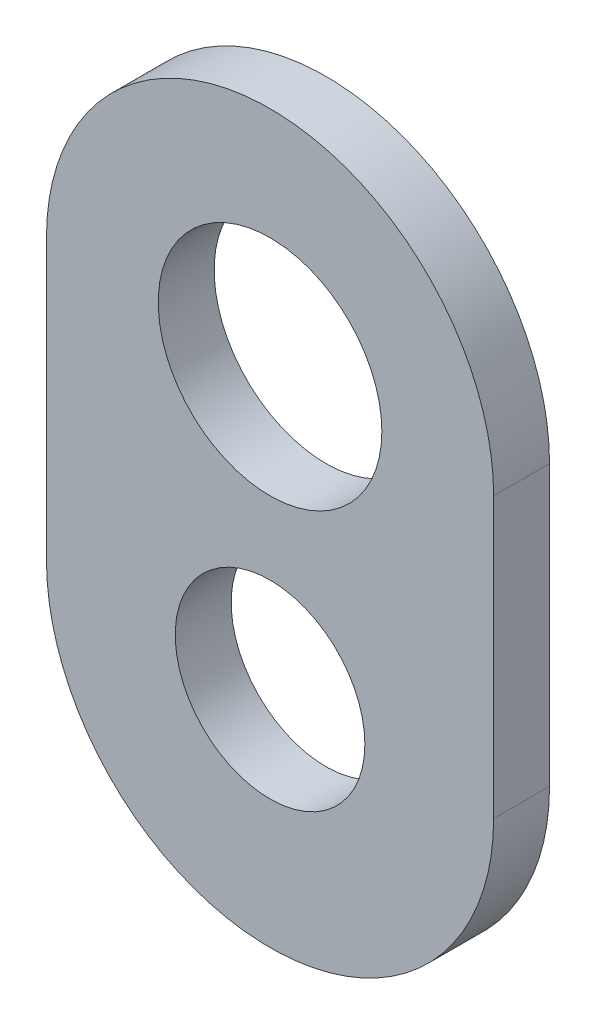
ISO-10303-21;
HEADER;
FILE_DESCRIPTION(('STEP AP214'),'2;1');
FILE_NAME('part.step','',(''),(''),'','','');
FILE_SCHEMA(('AUTOMOTIVE_DESIGN { 1 0 10303 214 1 1 1 1 }'));
ENDSEC;
DATA;
#1=APPLICATION_CONTEXT('core data for automotive mechanical design processes');
#2=APPLICATION_PROTOCOL_DEFINITION('international standard','automotive_design',2000,#1);
#3=PRODUCT_CONTEXT('',#1,'mechanical');
#4=PRODUCT('Part','Part','',(#3));
#5=PRODUCT_RELATED_PRODUCT_CATEGORY('part','',(#4));
#6=PRODUCT_DEFINITION_FORMATION('','',#4);
#7=PRODUCT_DEFINITION_CONTEXT('part definition',#1,'design');
#8=PRODUCT_DEFINITION('design','',#6,#7);
#9=PRODUCT_DEFINITION_SHAPE('','',#8);
#10=(LENGTH_UNIT() NAMED_UNIT(*) SI_UNIT(.MILLI.,.METRE.));
#11=(NAMED_UNIT(*) PLANE_ANGLE_UNIT() SI_UNIT($,.RADIAN.));
#12=(NAMED_UNIT(*) SI_UNIT($,.STERADIAN.) SOLID_ANGLE_UNIT());
#13=UNCERTAINTY_MEASURE_WITH_UNIT(LENGTH_MEASURE(1.E-05),#10,'distance_accuracy_value','');
#14=(GEOMETRIC_REPRESENTATION_CONTEXT(3) GLOBAL_UNCERTAINTY_ASSIGNED_CONTEXT((#13)) GLOBAL_UNIT_ASSIGNED_CONTEXT((#10,
#11,#12)) REPRESENTATION_CONTEXT('',''));
#15=CARTESIAN_POINT('',(0.,0.,0.));
#16=DIRECTION('',(0.,0.,1.));
#17=DIRECTION('',(1.,0.,0.));
#18=AXIS2_PLACEMENT_3D('',#15,#16,#17);
#19=CARTESIAN_POINT('',(0.,0.,6.35));
#20=DIRECTION('',(0.,0.,1.));
#21=DIRECTION('',(1.,0.,0.));
#22=AXIS2_PLACEMENT_3D('',#19,#20,#21);
#23=PLANE('',#22);
#24=CARTESIAN_POINT('',(0.,0.,6.35));
#25=DIRECTION('',(0.,0.,1.));
#26=DIRECTION('',(1.,0.,0.));
#27=AXIS2_PLACEMENT_3D('',#24,#25,#26);
#28=CIRCLE('',#27,12.7);
#29=CARTESIAN_POINT('',(12.7,0.,6.35));
#30=VERTEX_POINT('',#29);
#31=EDGE_CURVE('E106',#30,#30,#28,.T.);
#32=ORIENTED_EDGE('',*,*,#31,.F.);
#33=EDGE_LOOP('',(#32));
#34=FACE_BOUND('',#33,.T.);
#35=CARTESIAN_POINT('',(0.,0.,6.35));
#36=DIRECTION('',(0.,0.,1.));
#37=DIRECTION('',(1.,0.,0.));
#38=AXIS2_PLACEMENT_3D('',#35,#36,#37);
#39=CIRCLE('',#38,25.4);
#40=CARTESIAN_POINT('',(25.4,0.,6.35));
#41=VERTEX_POINT('',#40);
#42=CARTESIAN_POINT('',(-25.4,0.,6.35));
#43=VERTEX_POINT('',#42);
#44=EDGE_CURVE('E91',#41,#43,#39,.T.);
#45=ORIENTED_EDGE('',*,*,#44,.T.);
#46=DIRECTION('',(0.,-1.,0.));
#47=VECTOR('',#46,1.);
#48=CARTESIAN_POINT('',(-25.4,0.,6.35));
#49=LINE('',#48,#47);
#50=CARTESIAN_POINT('',(-25.4,-31.75,6.35));
#51=VERTEX_POINT('',#50);
#52=EDGE_CURVE('E86',#43,#51,#49,.T.);
#53=ORIENTED_EDGE('',*,*,#52,.T.);
#54=CARTESIAN_POINT('',(0.,-31.75,6.35));
#55=DIRECTION('',(0.,0.,1.));
#56=DIRECTION('',(1.,0.,0.));
#57=AXIS2_PLACEMENT_3D('',#54,#55,#56);
#58=CIRCLE('',#57,25.4);
#59=CARTESIAN_POINT('',(25.4,-31.75,6.35));
#60=VERTEX_POINT('',#59);
#61=EDGE_CURVE('E87',#51,#60,#58,.T.);
#62=ORIENTED_EDGE('',*,*,#61,.T.);
#63=DIRECTION('',(0.,1.,0.));
#64=VECTOR('',#63,1.);
#65=CARTESIAN_POINT('',(25.4,0.,6.35));
#66=LINE('',#65,#64);
#67=EDGE_CURVE('E57',#60,#41,#66,.T.);
#68=ORIENTED_EDGE('',*,*,#67,.T.);
#69=EDGE_LOOP('',(#45,#53,#62,#68));
#70=FACE_BOUND('',#69,.T.);
#71=CARTESIAN_POINT('',(0.,-31.75,6.35));
#72=DIRECTION('',(0.,0.,1.));
#73=DIRECTION('',(1.,0.,0.));
#74=AXIS2_PLACEMENT_3D('',#71,#72,#73);
#75=CIRCLE('',#74,10.7696);
#76=CARTESIAN_POINT('',(10.7696,-31.75,6.35));
#77=VERTEX_POINT('',#76);
#78=EDGE_CURVE('E123',#77,#77,#75,.T.);
#79=ORIENTED_EDGE('',*,*,#78,.F.);
#80=EDGE_LOOP('',(#79));
#81=FACE_BOUND('',#80,.T.);
#82=ADVANCED_FACE('F39',(#34,#70,#81),#23,.T.);
#83=CARTESIAN_POINT('',(0.,0.,0.));
#84=DIRECTION('',(0.,0.,1.));
#85=DIRECTION('',(1.,0.,0.));
#86=AXIS2_PLACEMENT_3D('',#83,#84,#85);
#87=PLANE('',#86);
#88=CARTESIAN_POINT('',(0.,0.,0.));
#89=DIRECTION('',(0.,0.,1.));
#90=DIRECTION('',(1.,0.,0.));
#91=AXIS2_PLACEMENT_3D('',#88,#89,#90);
#92=CIRCLE('',#91,25.4);
#93=CARTESIAN_POINT('',(25.4,0.,0.));
#94=VERTEX_POINT('',#93);
#95=CARTESIAN_POINT('',(-25.4,0.,0.));
#96=VERTEX_POINT('',#95);
#97=EDGE_CURVE('E104',#94,#96,#92,.T.);
#98=ORIENTED_EDGE('',*,*,#97,.F.);
#99=DIRECTION('',(0.,1.,0.));
#100=VECTOR('',#99,1.);
#101=CARTESIAN_POINT('',(25.4,0.,0.));
#102=LINE('',#101,#100);
#103=CARTESIAN_POINT('',(25.4,-31.75,0.));
#104=VERTEX_POINT('',#103);
#105=EDGE_CURVE('E80',#104,#94,#102,.T.);
#106=ORIENTED_EDGE('',*,*,#105,.F.);
#107=CARTESIAN_POINT('',(0.,-31.75,0.));
#108=DIRECTION('',(0.,0.,1.));
#109=DIRECTION('',(1.,0.,0.));
#110=AXIS2_PLACEMENT_3D('',#107,#108,#109);
#111=CIRCLE('',#110,25.4);
#112=CARTESIAN_POINT('',(-25.4,-31.75,0.));
#113=VERTEX_POINT('',#112);
#114=EDGE_CURVE('E74',#113,#104,#111,.T.);
#115=ORIENTED_EDGE('',*,*,#114,.F.);
#116=DIRECTION('',(0.,-1.,0.));
#117=VECTOR('',#116,1.);
#118=CARTESIAN_POINT('',(-25.4,0.,0.));
#119=LINE('',#118,#117);
#120=EDGE_CURVE('E94',#96,#113,#119,.T.);
#121=ORIENTED_EDGE('',*,*,#120,.F.);
#122=EDGE_LOOP('',(#98,#106,#115,#121));
#123=FACE_BOUND('',#122,.T.);
#124=CARTESIAN_POINT('',(0.,0.,0.));
#125=DIRECTION('',(0.,0.,1.));
#126=DIRECTION('',(1.,0.,0.));
#127=AXIS2_PLACEMENT_3D('',#124,#125,#126);
#128=CIRCLE('',#127,12.7);
#129=CARTESIAN_POINT('',(12.7,0.,0.));
#130=VERTEX_POINT('',#129);
#131=EDGE_CURVE('E119',#130,#130,#128,.T.);
#132=ORIENTED_EDGE('',*,*,#131,.T.);
#133=EDGE_LOOP('',(#132));
#134=FACE_BOUND('',#133,.T.);
#135=CARTESIAN_POINT('',(0.,-31.75,0.));
#136=DIRECTION('',(0.,0.,1.));
#137=DIRECTION('',(1.,0.,0.));
#138=AXIS2_PLACEMENT_3D('',#135,#136,#137);
#139=CIRCLE('',#138,10.7696);
#140=CARTESIAN_POINT('',(10.7696,-31.75,0.));
#141=VERTEX_POINT('',#140);
#142=EDGE_CURVE('E125',#141,#141,#139,.T.);
#143=ORIENTED_EDGE('',*,*,#142,.T.);
#144=EDGE_LOOP('',(#143));
#145=FACE_BOUND('',#144,.T.);
#146=ADVANCED_FACE('F114',(#123,#134,#145),#87,.F.);
#147=CARTESIAN_POINT('',(0.,0.,6.35));
#148=DIRECTION('',(0.,0.,-1.));
#149=DIRECTION('',(-1.,0.,0.));
#150=AXIS2_PLACEMENT_3D('',#147,#148,#149);
#151=CYLINDRICAL_SURFACE('',#150,25.4);
#152=ORIENTED_EDGE('',*,*,#97,.T.);
#153=DIRECTION('',(0.,0.,-1.));
#154=VECTOR('',#153,1.);
#155=CARTESIAN_POINT('',(-25.4,0.,6.35));
#156=LINE('',#155,#154);
#157=EDGE_CURVE('E11',#43,#96,#156,.T.);
#158=ORIENTED_EDGE('',*,*,#157,.F.);
#159=ORIENTED_EDGE('',*,*,#44,.F.);
#160=DIRECTION('',(0.,0.,-1.));
#161=VECTOR('',#160,1.);
#162=CARTESIAN_POINT('',(25.4,0.,6.35));
#163=LINE('',#162,#161);
#164=EDGE_CURVE('E98',#41,#94,#163,.T.);
#165=ORIENTED_EDGE('',*,*,#164,.T.);
#166=EDGE_LOOP('',(#152,#158,#159,#165));
#167=FACE_BOUND('',#166,.T.);
#168=ADVANCED_FACE('F41',(#167),#151,.T.);
#169=CARTESIAN_POINT('',(-25.4,0.,6.35));
#170=DIRECTION('',(1.,0.,0.));
#171=DIRECTION('',(0.,0.,-1.));
#172=AXIS2_PLACEMENT_3D('',#169,#170,#171);
#173=PLANE('',#172);
#174=ORIENTED_EDGE('',*,*,#120,.T.);
#175=DIRECTION('',(0.,0.,-1.));
#176=VECTOR('',#175,1.);
#177=CARTESIAN_POINT('',(-25.4,-31.75,6.35));
#178=LINE('',#177,#176);
#179=EDGE_CURVE('E48',#51,#113,#178,.T.);
#180=ORIENTED_EDGE('',*,*,#179,.F.);
#181=ORIENTED_EDGE('',*,*,#52,.F.);
#182=ORIENTED_EDGE('',*,*,#157,.T.);
#183=EDGE_LOOP('',(#174,#180,#181,#182));
#184=FACE_BOUND('',#183,.T.);
#185=ADVANCED_FACE('F92',(#184),#173,.F.);
#186=CARTESIAN_POINT('',(0.,-31.75,6.35));
#187=DIRECTION('',(0.,0.,-1.));
#188=DIRECTION('',(-1.,0.,0.));
#189=AXIS2_PLACEMENT_3D('',#186,#187,#188);
#190=CYLINDRICAL_SURFACE('',#189,25.4);
#191=ORIENTED_EDGE('',*,*,#114,.T.);
#192=DIRECTION('',(0.,0.,-1.));
#193=VECTOR('',#192,1.);
#194=CARTESIAN_POINT('',(25.4,-31.75,6.35));
#195=LINE('',#194,#193);
#196=EDGE_CURVE('E96',#60,#104,#195,.T.);
#197=ORIENTED_EDGE('',*,*,#196,.F.);
#198=ORIENTED_EDGE('',*,*,#61,.F.);
#199=ORIENTED_EDGE('',*,*,#179,.T.);
#200=EDGE_LOOP('',(#191,#197,#198,#199));
#201=FACE_BOUND('',#200,.T.);
#202=ADVANCED_FACE('F100',(#201),#190,.T.);
#203=CARTESIAN_POINT('',(25.4,0.,6.35));
#204=DIRECTION('',(-1.,0.,0.));
#205=DIRECTION('',(0.,0.,1.));
#206=AXIS2_PLACEMENT_3D('',#203,#204,#205);
#207=PLANE('',#206);
#208=ORIENTED_EDGE('',*,*,#105,.T.);
#209=ORIENTED_EDGE('',*,*,#164,.F.);
#210=ORIENTED_EDGE('',*,*,#67,.F.);
#211=ORIENTED_EDGE('',*,*,#196,.T.);
#212=EDGE_LOOP('',(#208,#209,#210,#211));
#213=FACE_BOUND('',#212,.T.);
#214=ADVANCED_FACE('F112',(#213),#207,.F.);
#215=CARTESIAN_POINT('',(0.,0.,6.35));
#216=DIRECTION('',(0.,0.,-1.));
#217=DIRECTION('',(-1.,0.,0.));
#218=AXIS2_PLACEMENT_3D('',#215,#216,#217);
#219=CYLINDRICAL_SURFACE('',#218,12.7);
#220=ORIENTED_EDGE('',*,*,#31,.T.);
#221=EDGE_LOOP('',(#220));
#222=FACE_BOUND('',#221,.T.);
#223=ORIENTED_EDGE('',*,*,#131,.F.);
#224=EDGE_LOOP('',(#223));
#225=FACE_BOUND('',#224,.T.);
#226=ADVANCED_FACE('F141',(#222,#225),#219,.F.);
#227=CARTESIAN_POINT('',(0.,-31.75,6.35));
#228=DIRECTION('',(0.,0.,-1.));
#229=DIRECTION('',(-1.,0.,0.));
#230=AXIS2_PLACEMENT_3D('',#227,#228,#229);
#231=CYLINDRICAL_SURFACE('',#230,10.7696);
#232=ORIENTED_EDGE('',*,*,#78,.T.);
#233=EDGE_LOOP('',(#232));
#234=FACE_BOUND('',#233,.T.);
#235=ORIENTED_EDGE('',*,*,#142,.F.);
#236=EDGE_LOOP('',(#235));
#237=FACE_BOUND('',#236,.T.);
#238=ADVANCED_FACE('F127',(#234,#237),#231,.F.);
#239=CLOSED_SHELL('',(#82,#146,#168,#185,#202,#214,#226,#238));
#240=MANIFOLD_SOLID_BREP('B2',#239);
#241=ADVANCED_BREP_SHAPE_REPRESENTATION('',(#18,#240),#14);
#242=SHAPE_DEFINITION_REPRESENTATION(#9,#241);
ENDSEC;
END-ISO-10303-21;
